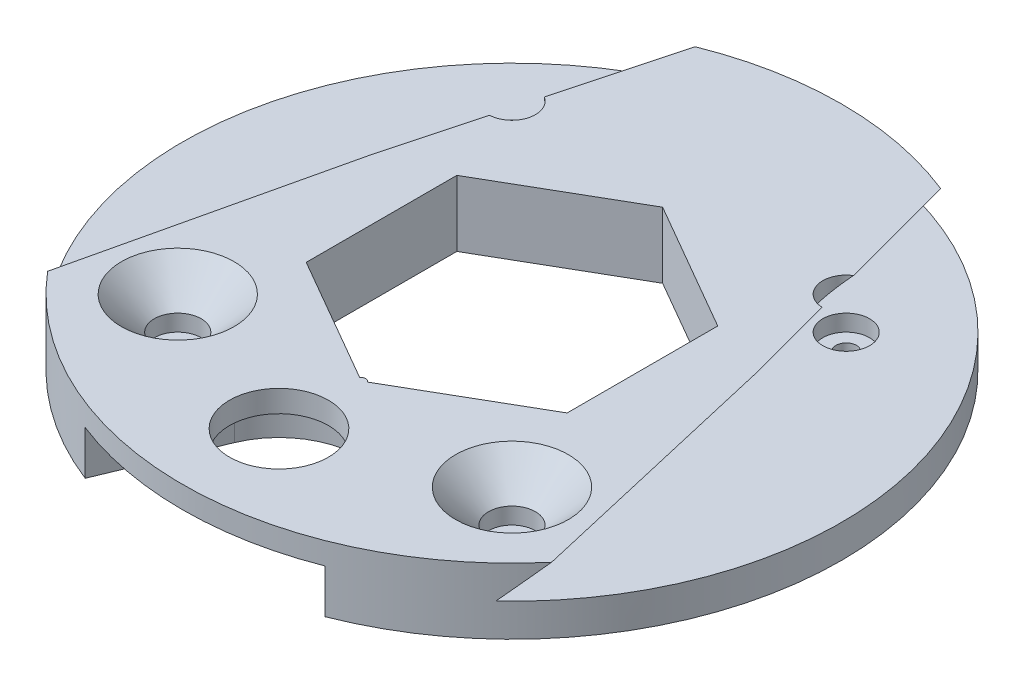
ISO-10303-21;
HEADER;
FILE_DESCRIPTION(('STEP AP214'),'2;1');
FILE_NAME('part.step','',(''),(''),'','','');
FILE_SCHEMA(('AUTOMOTIVE_DESIGN { 1 0 10303 214 1 1 1 1 }'));
ENDSEC;
DATA;
#1=APPLICATION_CONTEXT('core data for automotive mechanical design processes');
#2=APPLICATION_PROTOCOL_DEFINITION('international standard','automotive_design',2000,#1);
#3=PRODUCT_CONTEXT('',#1,'mechanical');
#4=PRODUCT('Part','Part','',(#3));
#5=PRODUCT_RELATED_PRODUCT_CATEGORY('part','',(#4));
#6=PRODUCT_DEFINITION_FORMATION('','',#4);
#7=PRODUCT_DEFINITION_CONTEXT('part definition',#1,'design');
#8=PRODUCT_DEFINITION('design','',#6,#7);
#9=PRODUCT_DEFINITION_SHAPE('','',#8);
#10=(LENGTH_UNIT() NAMED_UNIT(*) SI_UNIT(.MILLI.,.METRE.));
#11=(NAMED_UNIT(*) PLANE_ANGLE_UNIT() SI_UNIT($,.RADIAN.));
#12=(NAMED_UNIT(*) SI_UNIT($,.STERADIAN.) SOLID_ANGLE_UNIT());
#13=UNCERTAINTY_MEASURE_WITH_UNIT(LENGTH_MEASURE(1.E-05),#10,'distance_accuracy_value','');
#14=(GEOMETRIC_REPRESENTATION_CONTEXT(3) GLOBAL_UNCERTAINTY_ASSIGNED_CONTEXT((#13)) GLOBAL_UNIT_ASSIGNED_CONTEXT((#10,
#11,#12)) REPRESENTATION_CONTEXT('',''));
#15=CARTESIAN_POINT('',(0.,0.,0.));
#16=DIRECTION('',(0.,0.,1.));
#17=DIRECTION('',(1.,0.,0.));
#18=AXIS2_PLACEMENT_3D('',#15,#16,#17);
#19=CARTESIAN_POINT('',(0.,-5.,0.));
#20=DIRECTION('',(0.,1.,0.));
#21=DIRECTION('',(0.,0.,1.));
#22=AXIS2_PLACEMENT_3D('',#19,#20,#21);
#23=PLANE('',#22);
#24=CARTESIAN_POINT('',(-25.3553390593274,-5.,25.3553390593274));
#25=DIRECTION('',(0.,-1.,0.));
#26=DIRECTION('',(0.,0.,-1.));
#27=AXIS2_PLACEMENT_3D('',#24,#25,#26);
#28=CIRCLE('',#27,1.55);
#29=CARTESIAN_POINT('',(-25.3553390593274,-5.,23.8053390593274));
#30=VERTEX_POINT('',#29);
#31=EDGE_CURVE('E243',#30,#30,#28,.T.);
#32=ORIENTED_EDGE('',*,*,#31,.F.);
#33=EDGE_LOOP('',(#32));
#34=FACE_BOUND('',#33,.T.);
#35=CARTESIAN_POINT('',(25.3553390593274,-5.,25.3553390593274));
#36=DIRECTION('',(0.,-1.,0.));
#37=DIRECTION('',(0.,0.,-1.));
#38=AXIS2_PLACEMENT_3D('',#35,#36,#37);
#39=CIRCLE('',#38,1.55);
#40=CARTESIAN_POINT('',(25.3553390593274,-5.,23.8053390593274));
#41=VERTEX_POINT('',#40);
#42=EDGE_CURVE('E256',#41,#41,#39,.F.);
#43=ORIENTED_EDGE('',*,*,#42,.T.);
#44=EDGE_LOOP('',(#43));
#45=FACE_BOUND('',#44,.T.);
#46=CARTESIAN_POINT('',(-25.3553390593274,-5.,-25.3553390593274));
#47=DIRECTION('',(0.,-1.,0.));
#48=DIRECTION('',(0.,0.,-1.));
#49=AXIS2_PLACEMENT_3D('',#46,#47,#48);
#50=CIRCLE('',#49,1.55);
#51=CARTESIAN_POINT('',(-25.3553390593274,-5.,-26.9053390593274));
#52=VERTEX_POINT('',#51);
#53=EDGE_CURVE('E265',#52,#52,#50,.F.);
#54=ORIENTED_EDGE('',*,*,#53,.T.);
#55=EDGE_LOOP('',(#54));
#56=FACE_BOUND('',#55,.T.);
#57=CARTESIAN_POINT('',(25.3553390593274,-5.,-25.3553390593274));
#58=DIRECTION('',(0.,-1.,0.));
#59=DIRECTION('',(0.,0.,-1.));
#60=AXIS2_PLACEMENT_3D('',#57,#58,#59);
#61=CIRCLE('',#60,1.55);
#62=CARTESIAN_POINT('',(25.3553390593274,-5.,-26.9053390593274));
#63=VERTEX_POINT('',#62);
#64=EDGE_CURVE('E274',#63,#63,#61,.T.);
#65=ORIENTED_EDGE('',*,*,#64,.F.);
#66=EDGE_LOOP('',(#65));
#67=FACE_BOUND('',#66,.T.);
#68=CARTESIAN_POINT('',(0.,-5.,0.));
#69=DIRECTION('',(0.,1.,0.));
#70=DIRECTION('',(0.,0.,1.));
#71=AXIS2_PLACEMENT_3D('',#68,#69,#70);
#72=CIRCLE('',#71,50.);
#73=CARTESIAN_POINT('',(18.1786062240242,-5.,46.5783026284972));
#74=VERTEX_POINT('',#73);
#75=CARTESIAN_POINT('',(-18.1786062240242,-5.,46.5783026284972));
#76=VERTEX_POINT('',#75);
#77=EDGE_CURVE('E341',#74,#76,#72,.T.);
#78=ORIENTED_EDGE('',*,*,#77,.F.);
#79=DIRECTION('',(0.382683432365087,0.,0.923879532511288));
#80=VECTOR('',#79,1.);
#81=CARTESIAN_POINT('',(-0.951505843608835,-5.,0.394126625100029));
#82=LINE('',#81,#80);
#83=CARTESIAN_POINT('',(11.5484941563911,-5.,30.5717961547638));
#84=VERTEX_POINT('',#83);
#85=EDGE_CURVE('E304',#84,#74,#82,.T.);
#86=ORIENTED_EDGE('',*,*,#85,.F.);
#87=CARTESIAN_POINT('',(0.,-5.,35.3553390593274));
#88=DIRECTION('',(0.,-1.,0.));
#89=DIRECTION('',(0.,0.,-1.));
#90=AXIS2_PLACEMENT_3D('',#87,#88,#89);
#91=CIRCLE('',#90,12.5);
#92=CARTESIAN_POINT('',(-11.5484941563911,-5.,30.5717961547638));
#93=VERTEX_POINT('',#92);
#94=EDGE_CURVE('E319',#93,#84,#91,.T.);
#95=ORIENTED_EDGE('',*,*,#94,.F.);
#96=DIRECTION('',(0.382683432365088,0.,-0.923879532511288));
#97=VECTOR('',#96,1.);
#98=CARTESIAN_POINT('',(0.951505843608841,-5.,0.394126625100032));
#99=LINE('',#98,#97);
#100=EDGE_CURVE('E299',#76,#93,#99,.T.);
#101=ORIENTED_EDGE('',*,*,#100,.F.);
#102=EDGE_LOOP('',(#78,#86,#95,#101));
#103=FACE_BOUND('',#102,.T.);
#104=CARTESIAN_POINT('',(0.,-5.,22.8553390593274));
#105=DIRECTION('',(0.,1.,0.));
#106=DIRECTION('',(0.,0.,1.));
#107=AXIS2_PLACEMENT_3D('',#104,#105,#106);
#108=CIRCLE('',#107,0.663866640803791);
#109=CARTESIAN_POINT('',(0.574925375661118,-5.,22.5234057389255));
#110=VERTEX_POINT('',#109);
#111=CARTESIAN_POINT('',(-0.574925375661127,-5.,22.5234057389255));
#112=VERTEX_POINT('',#111);
#113=EDGE_CURVE('E195',#110,#112,#108,.T.);
#114=ORIENTED_EDGE('',*,*,#113,.F.);
#115=DIRECTION('',(0.866025403784438,0.,-0.500000000000001));
#116=VECTOR('',#115,1.);
#117=CARTESIAN_POINT('',(9.89665211874214,-5.,17.1415042944955));
#118=LINE('',#117,#116);
#119=CARTESIAN_POINT('',(19.7933042374843,-5.,11.4276695296636));
#120=VERTEX_POINT('',#119);
#121=EDGE_CURVE('E204',#110,#120,#118,.T.);
#122=ORIENTED_EDGE('',*,*,#121,.T.);
#123=DIRECTION('',(0.,0.,-1.));
#124=VECTOR('',#123,1.);
#125=CARTESIAN_POINT('',(19.7933042374842,-5.,0.));
#126=LINE('',#125,#124);
#127=CARTESIAN_POINT('',(19.7933042374842,-5.,-11.4276695296638));
#128=VERTEX_POINT('',#127);
#129=EDGE_CURVE('E78',#120,#128,#126,.T.);
#130=ORIENTED_EDGE('',*,*,#129,.T.);
#131=DIRECTION('',(-0.866025403784442,0.,-0.499999999999995));
#132=VECTOR('',#131,1.);
#133=CARTESIAN_POINT('',(9.89665211874202,-5.,-17.1415042944956));
#134=LINE('',#133,#132);
#135=CARTESIAN_POINT('',(-1.56125112837913E-13,-5.,-22.8553390593274));
#136=VERTEX_POINT('',#135);
#137=EDGE_CURVE('E218',#128,#136,#134,.T.);
#138=ORIENTED_EDGE('',*,*,#137,.T.);
#139=DIRECTION('',(-0.866025403784435,0.,0.500000000000007));
#140=VECTOR('',#139,1.);
#141=CARTESIAN_POINT('',(-9.89665211874225,-5.,-17.1415042944954));
#142=LINE('',#141,#140);
#143=CARTESIAN_POINT('',(-19.7933042374844,-5.,-11.4276695296635));
#144=VERTEX_POINT('',#143);
#145=EDGE_CURVE('E221',#136,#144,#142,.T.);
#146=ORIENTED_EDGE('',*,*,#145,.T.);
#147=DIRECTION('',(0.,0.,1.));
#148=VECTOR('',#147,1.);
#149=CARTESIAN_POINT('',(-19.7933042374842,-5.,2.04314785428253E-13));
#150=LINE('',#149,#148);
#151=CARTESIAN_POINT('',(-19.7933042374841,-5.,11.4276695296639));
#152=VERTEX_POINT('',#151);
#153=EDGE_CURVE('E224',#144,#152,#150,.T.);
#154=ORIENTED_EDGE('',*,*,#153,.T.);
#155=DIRECTION('',(0.866025403784441,0.,0.499999999999995));
#156=VECTOR('',#155,1.);
#157=CARTESIAN_POINT('',(-9.89665211874206,-5.,17.1415042944956));
#158=LINE('',#157,#156);
#159=EDGE_CURVE('E201',#152,#112,#158,.T.);
#160=ORIENTED_EDGE('',*,*,#159,.T.);
#161=EDGE_LOOP('',(#114,#122,#130,#138,#146,#154,#160));
#162=FACE_BOUND('',#161,.T.);
#163=ADVANCED_FACE('F62',(#34,#45,#56,#67,#103,#162),#23,.F.);
#164=CARTESIAN_POINT('',(0.,5.,0.));
#165=DIRECTION('',(0.,1.,0.));
#166=DIRECTION('',(0.,0.,1.));
#167=AXIS2_PLACEMENT_3D('',#164,#165,#166);
#168=PLANE('',#167);
#169=CARTESIAN_POINT('',(25.3553390593274,5.,25.3553390593274));
#170=DIRECTION('',(0.,1.,0.));
#171=DIRECTION('',(0.,0.,1.));
#172=AXIS2_PLACEMENT_3D('',#169,#170,#171);
#173=CIRCLE('',#172,8.55000000000002);
#174=CARTESIAN_POINT('',(25.3553390593274,5.,33.9053390593274));
#175=VERTEX_POINT('',#174);
#176=EDGE_CURVE('E71',#175,#175,#173,.F.);
#177=ORIENTED_EDGE('',*,*,#176,.T.);
#178=EDGE_LOOP('',(#177));
#179=FACE_BOUND('',#178,.T.);
#180=CARTESIAN_POINT('',(-25.3553390593274,5.,25.3553390593274));
#181=DIRECTION('',(0.,1.,0.));
#182=DIRECTION('',(0.,0.,1.));
#183=AXIS2_PLACEMENT_3D('',#180,#181,#182);
#184=CIRCLE('',#183,8.55);
#185=CARTESIAN_POINT('',(-25.3553390593274,5.,33.9053390593274));
#186=VERTEX_POINT('',#185);
#187=EDGE_CURVE('E391',#186,#186,#184,.F.);
#188=ORIENTED_EDGE('',*,*,#187,.T.);
#189=EDGE_LOOP('',(#188));
#190=FACE_BOUND('',#189,.T.);
#191=CARTESIAN_POINT('',(0.,5.,35.3553390593274));
#192=DIRECTION('',(0.,-1.,0.));
#193=DIRECTION('',(0.,0.,-1.));
#194=AXIS2_PLACEMENT_3D('',#191,#192,#193);
#195=CIRCLE('',#194,7.5);
#196=CARTESIAN_POINT('',(0.,5.,27.8553390593274));
#197=VERTEX_POINT('',#196);
#198=EDGE_CURVE('E326',#197,#197,#195,.T.);
#199=ORIENTED_EDGE('',*,*,#198,.T.);
#200=EDGE_LOOP('',(#199));
#201=FACE_BOUND('',#200,.T.);
#202=DIRECTION('',(0.258819045102514,0.,-0.96592582628907));
#203=VECTOR('',#202,1.);
#204=CARTESIAN_POINT('',(-28.9777747894681,5.,-7.76457135328871));
#205=LINE('',#204,#203);
#206=CARTESIAN_POINT('',(-23.4600344508429,5.,-28.3570586400107));
#207=VERTEX_POINT('',#206);
#208=CARTESIAN_POINT('',(-18.6250129855275,5.,-46.4016044042545));
#209=VERTEX_POINT('',#208);
#210=EDGE_CURVE('E338',#207,#209,#205,.T.);
#211=ORIENTED_EDGE('',*,*,#210,.F.);
#212=CARTESIAN_POINT('',(-25.3553390593274,5.,-25.3553390593274));
#213=DIRECTION('',(0.,-1.,0.));
#214=DIRECTION('',(0.,0.,-1.));
#215=AXIS2_PLACEMENT_3D('',#212,#213,#214);
#216=CIRCLE('',#215,3.55);
#217=CARTESIAN_POINT('',(-25.2148169108117,5.,-21.8081213431762));
#218=VERTEX_POINT('',#217);
#219=EDGE_CURVE('E280',#218,#207,#216,.F.);
#220=ORIENTED_EDGE('',*,*,#219,.F.);
#221=CARTESIAN_POINT('',(-29.0000460770927,5.,-7.68145377632381));
#222=VERTEX_POINT('',#221);
#223=EDGE_CURVE('E362',#222,#218,#205,.T.);
#224=ORIENTED_EDGE('',*,*,#223,.F.);
#225=DIRECTION('',(0.225428589041607,0.,-0.974259693943412));
#226=VECTOR('',#225,1.);
#227=CARTESIAN_POINT('',(-29.2133671977581,5.,-6.75952026906645));
#228=LINE('',#227,#226);
#229=CARTESIAN_POINT('',(-38.2330128463024,5.,32.2216810345841));
#230=VERTEX_POINT('',#229);
#231=EDGE_CURVE('E365',#230,#222,#228,.T.);
#232=ORIENTED_EDGE('',*,*,#231,.F.);
#233=CARTESIAN_POINT('',(0.,5.,0.));
#234=DIRECTION('',(0.,1.,0.));
#235=DIRECTION('',(0.,0.,1.));
#236=AXIS2_PLACEMENT_3D('',#233,#234,#235);
#237=CIRCLE('',#236,50.);
#238=CARTESIAN_POINT('',(38.2330128463024,5.,32.2216810345841));
#239=VERTEX_POINT('',#238);
#240=EDGE_CURVE('E340',#230,#239,#237,.T.);
#241=ORIENTED_EDGE('',*,*,#240,.T.);
#242=DIRECTION('',(0.225428589041607,0.,0.974259693943412));
#243=VECTOR('',#242,1.);
#244=CARTESIAN_POINT('',(29.2133671977581,5.,-6.75952026906647));
#245=LINE('',#244,#243);
#246=CARTESIAN_POINT('',(29.0000460770927,5.,-7.68145377632363));
#247=VERTEX_POINT('',#246);
#248=EDGE_CURVE('E373',#239,#247,#245,.F.);
#249=ORIENTED_EDGE('',*,*,#248,.T.);
#250=DIRECTION('',(0.258819045102514,0.,0.96592582628907));
#251=VECTOR('',#250,1.);
#252=CARTESIAN_POINT('',(28.9777747894681,5.,-7.76457135328871));
#253=LINE('',#252,#251);
#254=CARTESIAN_POINT('',(25.2148169108117,5.,-21.8081213431762));
#255=VERTEX_POINT('',#254);
#256=EDGE_CURVE('E339',#247,#255,#253,.F.);
#257=ORIENTED_EDGE('',*,*,#256,.T.);
#258=CARTESIAN_POINT('',(25.3553390593274,5.,-25.3553390593274));
#259=DIRECTION('',(0.,-1.,0.));
#260=DIRECTION('',(0.,0.,-1.));
#261=AXIS2_PLACEMENT_3D('',#258,#259,#260);
#262=CIRCLE('',#261,3.55);
#263=CARTESIAN_POINT('',(23.4600344508429,5.,-28.3570586400107));
#264=VERTEX_POINT('',#263);
#265=EDGE_CURVE('E283',#255,#264,#262,.T.);
#266=ORIENTED_EDGE('',*,*,#265,.T.);
#267=CARTESIAN_POINT('',(18.6250129855275,5.,-46.4016044042545));
#268=VERTEX_POINT('',#267);
#269=EDGE_CURVE('E377',#264,#268,#253,.F.);
#270=ORIENTED_EDGE('',*,*,#269,.T.);
#271=EDGE_CURVE('E335',#268,#209,#237,.T.);
#272=ORIENTED_EDGE('',*,*,#271,.T.);
#273=EDGE_LOOP('',(#211,#220,#224,#232,#241,#249,#257,#266,#270,#272));
#274=FACE_BOUND('',#273,.T.);
#275=DIRECTION('',(0.866025403784438,0.,-0.500000000000001));
#276=VECTOR('',#275,1.);
#277=CARTESIAN_POINT('',(9.89665211874214,5.,17.1415042944955));
#278=LINE('',#277,#276);
#279=CARTESIAN_POINT('',(0.574925375661117,5.,22.5234057389255));
#280=VERTEX_POINT('',#279);
#281=CARTESIAN_POINT('',(19.7933042374843,5.,11.4276695296636));
#282=VERTEX_POINT('',#281);
#283=EDGE_CURVE('E228',#280,#282,#278,.T.);
#284=ORIENTED_EDGE('',*,*,#283,.F.);
#285=CARTESIAN_POINT('',(0.,5.,22.8553390593274));
#286=DIRECTION('',(0.,1.,0.));
#287=DIRECTION('',(0.,0.,1.));
#288=AXIS2_PLACEMENT_3D('',#285,#286,#287);
#289=CIRCLE('',#288,0.663866640803791);
#290=CARTESIAN_POINT('',(-0.574925375661127,5.,22.5234057389255));
#291=VERTEX_POINT('',#290);
#292=EDGE_CURVE('E86',#280,#291,#289,.T.);
#293=ORIENTED_EDGE('',*,*,#292,.T.);
#294=DIRECTION('',(0.866025403784441,0.,0.499999999999995));
#295=VECTOR('',#294,1.);
#296=CARTESIAN_POINT('',(-9.89665211874206,5.,17.1415042944956));
#297=LINE('',#296,#295);
#298=CARTESIAN_POINT('',(-19.7933042374841,5.,11.4276695296639));
#299=VERTEX_POINT('',#298);
#300=EDGE_CURVE('E211',#299,#291,#297,.T.);
#301=ORIENTED_EDGE('',*,*,#300,.F.);
#302=DIRECTION('',(0.,0.,1.));
#303=VECTOR('',#302,1.);
#304=CARTESIAN_POINT('',(-19.7933042374842,5.,2.04314785428253E-13));
#305=LINE('',#304,#303);
#306=CARTESIAN_POINT('',(-19.7933042374844,5.,-11.4276695296635));
#307=VERTEX_POINT('',#306);
#308=EDGE_CURVE('E214',#307,#299,#305,.T.);
#309=ORIENTED_EDGE('',*,*,#308,.F.);
#310=DIRECTION('',(-0.866025403784435,0.,0.500000000000007));
#311=VECTOR('',#310,1.);
#312=CARTESIAN_POINT('',(-9.89665211874225,5.,-17.1415042944954));
#313=LINE('',#312,#311);
#314=CARTESIAN_POINT('',(-1.56125112837913E-13,5.,-22.8553390593274));
#315=VERTEX_POINT('',#314);
#316=EDGE_CURVE('E236',#315,#307,#313,.T.);
#317=ORIENTED_EDGE('',*,*,#316,.F.);
#318=DIRECTION('',(-0.866025403784442,0.,-0.499999999999995));
#319=VECTOR('',#318,1.);
#320=CARTESIAN_POINT('',(9.89665211874202,5.,-17.1415042944956));
#321=LINE('',#320,#319);
#322=CARTESIAN_POINT('',(19.7933042374842,5.,-11.4276695296638));
#323=VERTEX_POINT('',#322);
#324=EDGE_CURVE('E233',#323,#315,#321,.T.);
#325=ORIENTED_EDGE('',*,*,#324,.F.);
#326=DIRECTION('',(0.,0.,-1.));
#327=VECTOR('',#326,1.);
#328=CARTESIAN_POINT('',(19.7933042374842,5.,0.));
#329=LINE('',#328,#327);
#330=EDGE_CURVE('E230',#282,#323,#329,.T.);
#331=ORIENTED_EDGE('',*,*,#330,.F.);
#332=EDGE_LOOP('',(#284,#293,#301,#309,#317,#325,#331));
#333=FACE_BOUND('',#332,.T.);
#334=ADVANCED_FACE('F396',(#179,#190,#201,#274,#333),#168,.T.);
#335=CARTESIAN_POINT('',(-25.3553390593274,5.,25.3553390593274));
#336=DIRECTION('',(0.,-1.,0.));
#337=DIRECTION('',(0.,0.,-1.));
#338=AXIS2_PLACEMENT_3D('',#335,#336,#337);
#339=CYLINDRICAL_SURFACE('',#338,3.55);
#340=CARTESIAN_POINT('',(-25.3553390593274,0.,25.3553390593274));
#341=DIRECTION('',(0.,1.,0.));
#342=DIRECTION('',(0.,0.,1.));
#343=AXIS2_PLACEMENT_3D('',#340,#341,#342);
#344=CIRCLE('',#343,3.55);
#345=CARTESIAN_POINT('',(-25.3553390593274,0.,28.9053390593274));
#346=VERTEX_POINT('',#345);
#347=EDGE_CURVE('E12',#346,#346,#344,.T.);
#348=ORIENTED_EDGE('',*,*,#347,.T.);
#349=EDGE_LOOP('',(#348));
#350=FACE_BOUND('',#349,.T.);
#351=CARTESIAN_POINT('',(-25.3553390593274,-2.5,25.3553390593274));
#352=DIRECTION('',(0.,-1.,0.));
#353=DIRECTION('',(0.,0.,-1.));
#354=AXIS2_PLACEMENT_3D('',#351,#352,#353);
#355=CIRCLE('',#354,3.55);
#356=CARTESIAN_POINT('',(-25.3553390593274,-2.5,21.8053390593274));
#357=VERTEX_POINT('',#356);
#358=EDGE_CURVE('E385',#357,#357,#355,.F.);
#359=ORIENTED_EDGE('',*,*,#358,.F.);
#360=EDGE_LOOP('',(#359));
#361=FACE_BOUND('',#360,.T.);
#362=ADVANCED_FACE('F408',(#350,#361),#339,.F.);
#363=CARTESIAN_POINT('',(25.3553390593274,5.,25.3553390593274));
#364=DIRECTION('',(0.,-1.,0.));
#365=DIRECTION('',(0.,0.,-1.));
#366=AXIS2_PLACEMENT_3D('',#363,#364,#365);
#367=CYLINDRICAL_SURFACE('',#366,3.55);
#368=CARTESIAN_POINT('',(25.3553390593274,0.,25.3553390593274));
#369=DIRECTION('',(0.,1.,0.));
#370=DIRECTION('',(0.,0.,1.));
#371=AXIS2_PLACEMENT_3D('',#368,#369,#370);
#372=CIRCLE('',#371,3.55);
#373=CARTESIAN_POINT('',(25.3553390593274,0.,28.9053390593274));
#374=VERTEX_POINT('',#373);
#375=EDGE_CURVE('E388',#374,#374,#372,.T.);
#376=ORIENTED_EDGE('',*,*,#375,.T.);
#377=EDGE_LOOP('',(#376));
#378=FACE_BOUND('',#377,.T.);
#379=CARTESIAN_POINT('',(25.3553390593274,-2.5,25.3553390593274));
#380=DIRECTION('',(0.,-1.,0.));
#381=DIRECTION('',(0.,0.,-1.));
#382=AXIS2_PLACEMENT_3D('',#379,#380,#381);
#383=CIRCLE('',#382,3.55);
#384=CARTESIAN_POINT('',(25.3553390593274,-2.5,21.8053390593274));
#385=VERTEX_POINT('',#384);
#386=EDGE_CURVE('E259',#385,#385,#383,.F.);
#387=ORIENTED_EDGE('',*,*,#386,.F.);
#388=EDGE_LOOP('',(#387));
#389=FACE_BOUND('',#388,.T.);
#390=ADVANCED_FACE('F404',(#378,#389),#367,.F.);
#391=CARTESIAN_POINT('',(-25.3553390593274,5.,-25.3553390593274));
#392=DIRECTION('',(0.,-1.,0.));
#393=DIRECTION('',(0.,0.,-1.));
#394=AXIS2_PLACEMENT_3D('',#391,#392,#393);
#395=CYLINDRICAL_SURFACE('',#394,3.55);
#396=CARTESIAN_POINT('',(-25.3553390593274,0.,-25.3553390593274));
#397=DIRECTION('',(0.,1.,0.));
#398=DIRECTION('',(0.,0.,1.));
#399=AXIS2_PLACEMENT_3D('',#396,#397,#398);
#400=CIRCLE('',#399,3.55);
#401=CARTESIAN_POINT('',(-25.3553390593274,0.,-21.8053390593274));
#402=VERTEX_POINT('',#401);
#403=EDGE_CURVE('E296',#402,#402,#400,.F.);
#404=ORIENTED_EDGE('',*,*,#403,.F.);
#405=EDGE_LOOP('',(#404));
#406=FACE_BOUND('',#405,.T.);
#407=CARTESIAN_POINT('',(-25.3553390593274,-2.5,-25.3553390593274));
#408=DIRECTION('',(0.,-1.,0.));
#409=DIRECTION('',(0.,0.,-1.));
#410=AXIS2_PLACEMENT_3D('',#407,#408,#409);
#411=CIRCLE('',#410,3.55);
#412=CARTESIAN_POINT('',(-25.3553390593274,-2.5,-28.9053390593274));
#413=VERTEX_POINT('',#412);
#414=EDGE_CURVE('E268',#413,#413,#411,.F.);
#415=ORIENTED_EDGE('',*,*,#414,.F.);
#416=EDGE_LOOP('',(#415));
#417=FACE_BOUND('',#416,.T.);
#418=ADVANCED_FACE('F407',(#406,#417),#395,.F.);
#419=CARTESIAN_POINT('',(25.3553390593274,5.,-25.3553390593274));
#420=DIRECTION('',(0.,-1.,0.));
#421=DIRECTION('',(0.,0.,-1.));
#422=AXIS2_PLACEMENT_3D('',#419,#420,#421);
#423=CYLINDRICAL_SURFACE('',#422,3.55);
#424=CARTESIAN_POINT('',(25.3553390593274,0.,-25.3553390593274));
#425=DIRECTION('',(0.,1.,0.));
#426=DIRECTION('',(0.,0.,1.));
#427=AXIS2_PLACEMENT_3D('',#424,#425,#426);
#428=CIRCLE('',#427,3.55);
#429=CARTESIAN_POINT('',(25.3553390593274,0.,-21.8053390593274));
#430=VERTEX_POINT('',#429);
#431=EDGE_CURVE('E290',#430,#430,#428,.T.);
#432=ORIENTED_EDGE('',*,*,#431,.T.);
#433=EDGE_LOOP('',(#432));
#434=FACE_BOUND('',#433,.T.);
#435=CARTESIAN_POINT('',(25.3553390593274,-2.5,-25.3553390593274));
#436=DIRECTION('',(0.,-1.,0.));
#437=DIRECTION('',(0.,0.,-1.));
#438=AXIS2_PLACEMENT_3D('',#435,#436,#437);
#439=CIRCLE('',#438,3.55);
#440=CARTESIAN_POINT('',(25.3553390593274,-2.5,-28.9053390593274));
#441=VERTEX_POINT('',#440);
#442=EDGE_CURVE('E344',#441,#441,#439,.F.);
#443=ORIENTED_EDGE('',*,*,#442,.F.);
#444=EDGE_LOOP('',(#443));
#445=FACE_BOUND('',#444,.T.);
#446=ADVANCED_FACE('F487',(#434,#445),#423,.F.);
#447=CARTESIAN_POINT('',(-24.1481456580227,0.,-6.47047612777613));
#448=DIRECTION('',(-0.683012701892219,-0.707106781186549,-0.183012701892214));
#449=DIRECTION('',(0.719254596676404,-0.694746590606865,0.));
#450=AXIS2_PLACEMENT_3D('',#447,#448,#449);
#451=PLANE('',#450);
#452=ORIENTED_EDGE('',*,*,#223,.T.);
#453=CARTESIAN_POINT('',(-25.3553390593274,6.05382147448186,-25.3553390593274));
#454=DIRECTION('',(-0.683012701892219,-0.707106781186549,-0.183012701892214));
#455=DIRECTION('',(0.683012701892222,-0.707106781186546,0.183012701892215));
#456=AXIS2_PLACEMENT_3D('',#453,#454,#455);
#457=ELLIPSE('',#456,5.02045814642448,3.55);
#458=EDGE_CURVE('E293',#218,#207,#457,.F.);
#459=ORIENTED_EDGE('',*,*,#458,.T.);
#460=ORIENTED_EDGE('',*,*,#210,.T.);
#461=CARTESIAN_POINT('',(0.,-25.000000000824,0.));
#462=DIRECTION('',(-0.683012701892219,-0.707106781186549,-0.183012701892214));
#463=DIRECTION('',(-0.683012701892222,0.707106781186546,-0.183012701892215));
#464=AXIS2_PLACEMENT_3D('',#461,#462,#463);
#465=ELLIPSE('',#464,70.7106781186546,50.);
#466=CARTESIAN_POINT('',(-12.9409522560455,0.,-48.2962913142071));
#467=VERTEX_POINT('',#466);
#468=EDGE_CURVE('E351',#209,#467,#465,.T.);
#469=ORIENTED_EDGE('',*,*,#468,.T.);
#470=DIRECTION('',(0.258819045102514,0.,-0.96592582628907));
#471=VECTOR('',#470,1.);
#472=CARTESIAN_POINT('',(-24.1481456580227,0.,-6.47047612777613));
#473=LINE('',#472,#471);
#474=CARTESIAN_POINT('',(-24.1481456580227,0.,-6.47047612777609));
#475=VERTEX_POINT('',#474);
#476=EDGE_CURVE('E357',#475,#467,#473,.T.);
#477=ORIENTED_EDGE('',*,*,#476,.F.);
#478=DIRECTION('',(0.686111536058134,-0.707054428983578,0.171245421961158));
#479=VECTOR('',#478,1.);
#480=CARTESIAN_POINT('',(-24.1409636291716,-0.00740125335516045,-6.46868357729922));
#481=LINE('',#480,#479);
#482=EDGE_CURVE('E349',#222,#475,#481,.T.);
#483=ORIENTED_EDGE('',*,*,#482,.F.);
#484=EDGE_LOOP('',(#452,#459,#460,#469,#477,#483));
#485=FACE_BOUND('',#484,.T.);
#486=ADVANCED_FACE('F469',(#485),#451,.T.);
#487=CARTESIAN_POINT('',(0.,5.,35.3553390593274));
#488=DIRECTION('',(0.,-1.,0.));
#489=DIRECTION('',(0.,0.,-1.));
#490=AXIS2_PLACEMENT_3D('',#487,#488,#489);
#491=CYLINDRICAL_SURFACE('',#490,7.5);
#492=ORIENTED_EDGE('',*,*,#198,.F.);
#493=EDGE_LOOP('',(#492));
#494=FACE_BOUND('',#493,.T.);
#495=CARTESIAN_POINT('',(0.,1.66666666666667,35.3553390593274));
#496=DIRECTION('',(0.,-1.,0.));
#497=DIRECTION('',(0.,0.,-1.));
#498=AXIS2_PLACEMENT_3D('',#495,#496,#497);
#499=CIRCLE('',#498,7.5);
#500=CARTESIAN_POINT('',(0.,1.66666666666667,27.8553390593274));
#501=VERTEX_POINT('',#500);
#502=EDGE_CURVE('E313',#501,#501,#499,.F.);
#503=ORIENTED_EDGE('',*,*,#502,.F.);
#504=EDGE_LOOP('',(#503));
#505=FACE_BOUND('',#504,.T.);
#506=ADVANCED_FACE('F465',(#494,#505),#491,.F.);
#507=CARTESIAN_POINT('',(0.,0.,0.));
#508=DIRECTION('',(0.,1.,0.));
#509=DIRECTION('',(0.,0.,1.));
#510=AXIS2_PLACEMENT_3D('',#507,#508,#509);
#511=PLANE('',#510);
#512=ORIENTED_EDGE('',*,*,#403,.T.);
#513=EDGE_LOOP('',(#512));
#514=FACE_BOUND('',#513,.T.);
#515=CARTESIAN_POINT('',(0.,0.,0.));
#516=DIRECTION('',(0.,1.,0.));
#517=DIRECTION('',(0.,0.,1.));
#518=AXIS2_PLACEMENT_3D('',#515,#516,#517);
#519=CIRCLE('',#518,50.);
#520=CARTESIAN_POINT('',(-34.10533906,0.,36.562629112284));
#521=VERTEX_POINT('',#520);
#522=EDGE_CURVE('E348',#467,#521,#519,.T.);
#523=ORIENTED_EDGE('',*,*,#522,.T.);
#524=DIRECTION('',(0.225428589041607,0.,-0.974259693943412));
#525=VECTOR('',#524,1.);
#526=CARTESIAN_POINT('',(-24.3420687280411,0.,-5.63237732385841));
#527=LINE('',#526,#525);
#528=EDGE_CURVE('E353',#521,#475,#527,.T.);
#529=ORIENTED_EDGE('',*,*,#528,.T.);
#530=ORIENTED_EDGE('',*,*,#476,.T.);
#531=EDGE_LOOP('',(#523,#529,#530));
#532=FACE_BOUND('',#531,.T.);
#533=ADVANCED_FACE('F468',(#514,#532),#511,.T.);
#534=CARTESIAN_POINT('',(0.,-5.,0.));
#535=DIRECTION('',(0.,1.,0.));
#536=DIRECTION('',(0.,0.,1.));
#537=AXIS2_PLACEMENT_3D('',#534,#535,#536);
#538=CYLINDRICAL_SURFACE('',#537,50.);
#539=DIRECTION('',(0.,-1.,0.));
#540=VECTOR('',#539,1.);
#541=CARTESIAN_POINT('',(18.1786062240242,1.66666666666667,46.5783026284972));
#542=LINE('',#541,#540);
#543=CARTESIAN_POINT('',(18.1786062240242,1.66666666666667,46.5783026284972));
#544=VERTEX_POINT('',#543);
#545=EDGE_CURVE('E323',#544,#74,#542,.T.);
#546=ORIENTED_EDGE('',*,*,#545,.T.);
#547=ORIENTED_EDGE('',*,*,#77,.T.);
#548=DIRECTION('',(0.,-1.,0.));
#549=VECTOR('',#548,1.);
#550=CARTESIAN_POINT('',(-18.1786062240242,1.66666666666667,46.5783026284972));
#551=LINE('',#550,#549);
#552=CARTESIAN_POINT('',(-18.1786062240242,1.66666666666667,46.5783026284972));
#553=VERTEX_POINT('',#552);
#554=EDGE_CURVE('E316',#553,#76,#551,.T.);
#555=ORIENTED_EDGE('',*,*,#554,.F.);
#556=CARTESIAN_POINT('',(0.,1.66666666666667,0.));
#557=DIRECTION('',(0.,-1.,0.));
#558=DIRECTION('',(0.,0.,-1.));
#559=AXIS2_PLACEMENT_3D('',#556,#557,#558);
#560=CIRCLE('',#559,50.);
#561=EDGE_CURVE('E300',#544,#553,#560,.T.);
#562=ORIENTED_EDGE('',*,*,#561,.F.);
#563=EDGE_LOOP('',(#546,#547,#555,#562));
#564=FACE_BOUND('',#563,.T.);
#565=CARTESIAN_POINT('',(34.10533906,0.,36.562629112284));
#566=VERTEX_POINT('',#565);
#567=CARTESIAN_POINT('',(12.9409522560455,0.,-48.2962913142071));
#568=VERTEX_POINT('',#567);
#569=EDGE_CURVE('E345',#566,#568,#519,.T.);
#570=ORIENTED_EDGE('',*,*,#569,.F.);
#571=CARTESIAN_POINT('',(0.,-24.985195301998,0.));
#572=DIRECTION('',(0.688905636224115,-0.707106781186549,-0.159402083984636));
#573=DIRECTION('',(0.688905636224118,0.707106781186546,-0.159402083984636));
#574=AXIS2_PLACEMENT_3D('',#571,#572,#573);
#575=ELLIPSE('',#574,70.7106781186546,50.);
#576=EDGE_CURVE('E369',#239,#566,#575,.T.);
#577=ORIENTED_EDGE('',*,*,#576,.F.);
#578=ORIENTED_EDGE('',*,*,#240,.F.);
#579=CARTESIAN_POINT('',(0.,-24.985195301998,0.));
#580=DIRECTION('',(-0.688905636224116,-0.707106781186549,-0.159402083984635));
#581=DIRECTION('',(-0.688905636224118,0.707106781186546,-0.159402083984636));
#582=AXIS2_PLACEMENT_3D('',#579,#580,#581);
#583=ELLIPSE('',#582,70.7106781186546,50.);
#584=EDGE_CURVE('E352',#230,#521,#583,.F.);
#585=ORIENTED_EDGE('',*,*,#584,.T.);
#586=ORIENTED_EDGE('',*,*,#522,.F.);
#587=ORIENTED_EDGE('',*,*,#468,.F.);
#588=ORIENTED_EDGE('',*,*,#271,.F.);
#589=CARTESIAN_POINT('',(0.,-25.000000000824,0.));
#590=DIRECTION('',(0.683012701892219,-0.707106781186549,-0.183012701892214));
#591=DIRECTION('',(0.683012701892222,0.707106781186546,-0.183012701892215));
#592=AXIS2_PLACEMENT_3D('',#589,#590,#591);
#593=ELLIPSE('',#592,70.7106781186546,50.);
#594=EDGE_CURVE('E361',#268,#568,#593,.F.);
#595=ORIENTED_EDGE('',*,*,#594,.T.);
#596=EDGE_LOOP('',(#570,#577,#578,#585,#586,#587,#588,#595));
#597=FACE_BOUND('',#596,.T.);
#598=ADVANCED_FACE('F440',(#564,#597),#538,.T.);
#599=ORIENTED_EDGE('',*,*,#431,.F.);
#600=EDGE_LOOP('',(#599));
#601=FACE_BOUND('',#600,.T.);
#602=DIRECTION('',(0.258819045102514,0.,0.96592582628907));
#603=VECTOR('',#602,1.);
#604=CARTESIAN_POINT('',(24.1481456580227,0.,-6.47047612777613));
#605=LINE('',#604,#603);
#606=CARTESIAN_POINT('',(24.1481456580228,0.,-6.47047612777591));
#607=VERTEX_POINT('',#606);
#608=EDGE_CURVE('E334',#607,#568,#605,.F.);
#609=ORIENTED_EDGE('',*,*,#608,.F.);
#610=DIRECTION('',(0.225428589041607,0.,0.974259693943412));
#611=VECTOR('',#610,1.);
#612=CARTESIAN_POINT('',(24.3420687280411,0.,-5.63237732385843));
#613=LINE('',#612,#611);
#614=EDGE_CURVE('E356',#566,#607,#613,.F.);
#615=ORIENTED_EDGE('',*,*,#614,.F.);
#616=ORIENTED_EDGE('',*,*,#569,.T.);
#617=EDGE_LOOP('',(#609,#615,#616));
#618=FACE_BOUND('',#617,.T.);
#619=ADVANCED_FACE('F473',(#601,#618),#511,.T.);
#620=CARTESIAN_POINT('',(24.1481456580227,0.,-6.47047612777613));
#621=DIRECTION('',(0.683012701892219,-0.707106781186549,-0.183012701892214));
#622=DIRECTION('',(0.719254596676404,0.694746590606865,0.));
#623=AXIS2_PLACEMENT_3D('',#620,#621,#622);
#624=PLANE('',#623);
#625=ORIENTED_EDGE('',*,*,#269,.F.);
#626=CARTESIAN_POINT('',(25.3553390593274,6.05382147448186,-25.3553390593274));
#627=DIRECTION('',(0.683012701892219,-0.707106781186549,-0.183012701892214));
#628=DIRECTION('',(-0.683012701892222,-0.707106781186546,0.183012701892215));
#629=AXIS2_PLACEMENT_3D('',#626,#627,#628);
#630=ELLIPSE('',#629,5.02045814642448,3.55);
#631=EDGE_CURVE('E286',#264,#255,#630,.F.);
#632=ORIENTED_EDGE('',*,*,#631,.T.);
#633=ORIENTED_EDGE('',*,*,#256,.F.);
#634=DIRECTION('',(-0.686111536058134,-0.707054428983578,0.171245421961156));
#635=VECTOR('',#634,1.);
#636=CARTESIAN_POINT('',(24.1481456580228,0.,-6.47047612777591));
#637=LINE('',#636,#635);
#638=EDGE_CURVE('E370',#247,#607,#637,.T.);
#639=ORIENTED_EDGE('',*,*,#638,.T.);
#640=ORIENTED_EDGE('',*,*,#608,.T.);
#641=ORIENTED_EDGE('',*,*,#594,.F.);
#642=EDGE_LOOP('',(#625,#632,#633,#639,#640,#641));
#643=FACE_BOUND('',#642,.T.);
#644=ADVANCED_FACE('F476',(#643),#624,.T.);
#645=CARTESIAN_POINT('',(-24.3420687280411,0.,-5.63237732385841));
#646=DIRECTION('',(-0.688905636224116,-0.707106781186549,-0.159402083984635));
#647=DIRECTION('',(0.71626513077411,-0.697828247090319,0.));
#648=AXIS2_PLACEMENT_3D('',#645,#646,#647);
#649=PLANE('',#648);
#650=ORIENTED_EDGE('',*,*,#528,.F.);
#651=ORIENTED_EDGE('',*,*,#584,.F.);
#652=ORIENTED_EDGE('',*,*,#231,.T.);
#653=ORIENTED_EDGE('',*,*,#482,.T.);
#654=EDGE_LOOP('',(#650,#651,#652,#653));
#655=FACE_BOUND('',#654,.T.);
#656=ADVANCED_FACE('F480',(#655),#649,.T.);
#657=CARTESIAN_POINT('',(24.3420687280411,0.,-5.63237732385843));
#658=DIRECTION('',(0.688905636224115,-0.707106781186549,-0.159402083984636));
#659=DIRECTION('',(0.71626513077411,0.697828247090319,0.));
#660=AXIS2_PLACEMENT_3D('',#657,#658,#659);
#661=PLANE('',#660);
#662=ORIENTED_EDGE('',*,*,#614,.T.);
#663=ORIENTED_EDGE('',*,*,#638,.F.);
#664=ORIENTED_EDGE('',*,*,#248,.F.);
#665=ORIENTED_EDGE('',*,*,#576,.T.);
#666=EDGE_LOOP('',(#662,#663,#664,#665));
#667=FACE_BOUND('',#666,.T.);
#668=ADVANCED_FACE('F483',(#667),#661,.T.);
#669=CARTESIAN_POINT('',(-0.951505843608835,1.66666666666667,0.394126625100029));
#670=DIRECTION('',(0.923879532511288,0.,-0.382683432365087));
#671=DIRECTION('',(-0.382683432365087,0.,-0.923879532511288));
#672=AXIS2_PLACEMENT_3D('',#669,#670,#671);
#673=PLANE('',#672);
#674=ORIENTED_EDGE('',*,*,#85,.T.);
#675=ORIENTED_EDGE('',*,*,#545,.F.);
#676=DIRECTION('',(0.382683432365087,0.,0.923879532511288));
#677=VECTOR('',#676,1.);
#678=CARTESIAN_POINT('',(-0.951505843608835,1.66666666666667,0.394126625100029));
#679=LINE('',#678,#677);
#680=CARTESIAN_POINT('',(11.5484941563911,1.66666666666667,30.5717961547638));
#681=VERTEX_POINT('',#680);
#682=EDGE_CURVE('E310',#681,#544,#679,.T.);
#683=ORIENTED_EDGE('',*,*,#682,.F.);
#684=DIRECTION('',(0.,-1.,0.));
#685=VECTOR('',#684,1.);
#686=CARTESIAN_POINT('',(11.5484941563911,1.66666666666667,30.5717961547638));
#687=LINE('',#686,#685);
#688=EDGE_CURVE('E327',#681,#84,#687,.T.);
#689=ORIENTED_EDGE('',*,*,#688,.T.);
#690=EDGE_LOOP('',(#674,#675,#683,#689));
#691=FACE_BOUND('',#690,.T.);
#692=ADVANCED_FACE('F445',(#691),#673,.F.);
#693=CARTESIAN_POINT('',(0.,1.66666666666667,35.3553390593274));
#694=DIRECTION('',(0.,-1.,0.));
#695=DIRECTION('',(0.,0.,-1.));
#696=AXIS2_PLACEMENT_3D('',#693,#694,#695);
#697=CYLINDRICAL_SURFACE('',#696,12.5);
#698=ORIENTED_EDGE('',*,*,#94,.T.);
#699=ORIENTED_EDGE('',*,*,#688,.F.);
#700=CARTESIAN_POINT('',(0.,1.66666666666667,35.3553390593274));
#701=DIRECTION('',(0.,-1.,0.));
#702=DIRECTION('',(0.,0.,-1.));
#703=AXIS2_PLACEMENT_3D('',#700,#701,#702);
#704=CIRCLE('',#703,12.5);
#705=CARTESIAN_POINT('',(-11.5484941563911,1.66666666666667,30.5717961547638));
#706=VERTEX_POINT('',#705);
#707=EDGE_CURVE('E307',#706,#681,#704,.T.);
#708=ORIENTED_EDGE('',*,*,#707,.F.);
#709=DIRECTION('',(0.,-1.,0.));
#710=VECTOR('',#709,1.);
#711=CARTESIAN_POINT('',(-11.5484941563911,1.66666666666667,30.5717961547638));
#712=LINE('',#711,#710);
#713=EDGE_CURVE('E329',#706,#93,#712,.T.);
#714=ORIENTED_EDGE('',*,*,#713,.T.);
#715=EDGE_LOOP('',(#698,#699,#708,#714));
#716=FACE_BOUND('',#715,.T.);
#717=ADVANCED_FACE('F451',(#716),#697,.F.);
#718=CARTESIAN_POINT('',(0.951505843608841,1.66666666666667,0.394126625100032));
#719=DIRECTION('',(-0.923879532511288,0.,-0.382683432365087));
#720=DIRECTION('',(-0.382683432365088,0.,0.923879532511288));
#721=AXIS2_PLACEMENT_3D('',#718,#719,#720);
#722=PLANE('',#721);
#723=ORIENTED_EDGE('',*,*,#100,.T.);
#724=ORIENTED_EDGE('',*,*,#713,.F.);
#725=DIRECTION('',(0.382683432365088,0.,-0.923879532511288));
#726=VECTOR('',#725,1.);
#727=CARTESIAN_POINT('',(0.951505843608841,1.66666666666667,0.394126625100032));
#728=LINE('',#727,#726);
#729=EDGE_CURVE('E303',#553,#706,#728,.T.);
#730=ORIENTED_EDGE('',*,*,#729,.F.);
#731=ORIENTED_EDGE('',*,*,#554,.T.);
#732=EDGE_LOOP('',(#723,#724,#730,#731));
#733=FACE_BOUND('',#732,.T.);
#734=ADVANCED_FACE('F453',(#733),#722,.F.);
#735=CARTESIAN_POINT('',(0.,1.66666666666667,0.));
#736=DIRECTION('',(0.,-1.,0.));
#737=DIRECTION('',(0.,0.,-1.));
#738=AXIS2_PLACEMENT_3D('',#735,#736,#737);
#739=PLANE('',#738);
#740=ORIENTED_EDGE('',*,*,#561,.T.);
#741=ORIENTED_EDGE('',*,*,#729,.T.);
#742=ORIENTED_EDGE('',*,*,#707,.T.);
#743=ORIENTED_EDGE('',*,*,#682,.T.);
#744=EDGE_LOOP('',(#740,#741,#742,#743));
#745=FACE_BOUND('',#744,.T.);
#746=ORIENTED_EDGE('',*,*,#502,.T.);
#747=EDGE_LOOP('',(#746));
#748=FACE_BOUND('',#747,.T.);
#749=ADVANCED_FACE('F447',(#745,#748),#739,.T.);
#750=ORIENTED_EDGE('',*,*,#265,.F.);
#751=ORIENTED_EDGE('',*,*,#631,.F.);
#752=EDGE_LOOP('',(#750,#751));
#753=FACE_BOUND('',#752,.T.);
#754=ADVANCED_FACE('F460',(#753),#423,.F.);
#755=ORIENTED_EDGE('',*,*,#219,.T.);
#756=ORIENTED_EDGE('',*,*,#458,.F.);
#757=EDGE_LOOP('',(#755,#756));
#758=FACE_BOUND('',#757,.T.);
#759=ADVANCED_FACE('F520',(#758),#395,.F.);
#760=CARTESIAN_POINT('',(25.3553390593274,-2.5,-25.3553390593274));
#761=DIRECTION('',(0.,-1.,0.));
#762=DIRECTION('',(0.,0.,-1.));
#763=AXIS2_PLACEMENT_3D('',#760,#761,#762);
#764=CYLINDRICAL_SURFACE('',#763,1.55);
#765=CARTESIAN_POINT('',(25.3553390593274,-2.5,-25.3553390593274));
#766=DIRECTION('',(0.,-1.,0.));
#767=DIRECTION('',(0.,0.,-1.));
#768=AXIS2_PLACEMENT_3D('',#765,#766,#767);
#769=CIRCLE('',#768,1.55);
#770=CARTESIAN_POINT('',(25.3553390593274,-2.5,-26.9053390593274));
#771=VERTEX_POINT('',#770);
#772=EDGE_CURVE('E277',#771,#771,#769,.T.);
#773=ORIENTED_EDGE('',*,*,#772,.F.);
#774=EDGE_LOOP('',(#773));
#775=FACE_BOUND('',#774,.T.);
#776=ORIENTED_EDGE('',*,*,#64,.T.);
#777=EDGE_LOOP('',(#776));
#778=FACE_BOUND('',#777,.T.);
#779=ADVANCED_FACE('F525',(#775,#778),#764,.F.);
#780=CARTESIAN_POINT('',(0.,-2.5,0.));
#781=DIRECTION('',(0.,-1.,0.));
#782=DIRECTION('',(0.,0.,-1.));
#783=AXIS2_PLACEMENT_3D('',#780,#781,#782);
#784=PLANE('',#783);
#785=ORIENTED_EDGE('',*,*,#772,.T.);
#786=EDGE_LOOP('',(#785));
#787=FACE_BOUND('',#786,.T.);
#788=ORIENTED_EDGE('',*,*,#442,.T.);
#789=EDGE_LOOP('',(#788));
#790=FACE_BOUND('',#789,.T.);
#791=ADVANCED_FACE('F539',(#787,#790),#784,.F.);
#792=CARTESIAN_POINT('',(-25.3553390593274,-2.5,-25.3553390593274));
#793=DIRECTION('',(0.,-1.,0.));
#794=DIRECTION('',(0.,0.,-1.));
#795=AXIS2_PLACEMENT_3D('',#792,#793,#794);
#796=CYLINDRICAL_SURFACE('',#795,1.55);
#797=CARTESIAN_POINT('',(-25.3553390593274,-2.5,-25.3553390593274));
#798=DIRECTION('',(0.,-1.,0.));
#799=DIRECTION('',(0.,0.,-1.));
#800=AXIS2_PLACEMENT_3D('',#797,#798,#799);
#801=CIRCLE('',#800,1.55);
#802=CARTESIAN_POINT('',(-25.3553390593274,-2.5,-26.9053390593274));
#803=VERTEX_POINT('',#802);
#804=EDGE_CURVE('E271',#803,#803,#801,.F.);
#805=ORIENTED_EDGE('',*,*,#804,.T.);
#806=EDGE_LOOP('',(#805));
#807=FACE_BOUND('',#806,.T.);
#808=ORIENTED_EDGE('',*,*,#53,.F.);
#809=EDGE_LOOP('',(#808));
#810=FACE_BOUND('',#809,.T.);
#811=ADVANCED_FACE('F541',(#807,#810),#796,.F.);
#812=CARTESIAN_POINT('',(0.,-2.5,0.));
#813=DIRECTION('',(0.,-1.,0.));
#814=DIRECTION('',(0.,0.,-1.));
#815=AXIS2_PLACEMENT_3D('',#812,#813,#814);
#816=PLANE('',#815);
#817=ORIENTED_EDGE('',*,*,#414,.T.);
#818=EDGE_LOOP('',(#817));
#819=FACE_BOUND('',#818,.T.);
#820=ORIENTED_EDGE('',*,*,#804,.F.);
#821=EDGE_LOOP('',(#820));
#822=FACE_BOUND('',#821,.T.);
#823=ADVANCED_FACE('F422',(#819,#822),#816,.F.);
#824=CARTESIAN_POINT('',(25.3553390593274,-2.5,25.3553390593274));
#825=DIRECTION('',(0.,-1.,0.));
#826=DIRECTION('',(0.,0.,-1.));
#827=AXIS2_PLACEMENT_3D('',#824,#825,#826);
#828=CYLINDRICAL_SURFACE('',#827,1.55);
#829=CARTESIAN_POINT('',(25.3553390593274,-2.5,25.3553390593274));
#830=DIRECTION('',(0.,-1.,0.));
#831=DIRECTION('',(0.,0.,-1.));
#832=AXIS2_PLACEMENT_3D('',#829,#830,#831);
#833=CIRCLE('',#832,1.55);
#834=CARTESIAN_POINT('',(25.3553390593274,-2.5,23.8053390593274));
#835=VERTEX_POINT('',#834);
#836=EDGE_CURVE('E262',#835,#835,#833,.F.);
#837=ORIENTED_EDGE('',*,*,#836,.T.);
#838=EDGE_LOOP('',(#837));
#839=FACE_BOUND('',#838,.T.);
#840=ORIENTED_EDGE('',*,*,#42,.F.);
#841=EDGE_LOOP('',(#840));
#842=FACE_BOUND('',#841,.T.);
#843=ADVANCED_FACE('F416',(#839,#842),#828,.F.);
#844=CARTESIAN_POINT('',(0.,-2.5,0.));
#845=DIRECTION('',(0.,-1.,0.));
#846=DIRECTION('',(0.,0.,-1.));
#847=AXIS2_PLACEMENT_3D('',#844,#845,#846);
#848=PLANE('',#847);
#849=ORIENTED_EDGE('',*,*,#386,.T.);
#850=EDGE_LOOP('',(#849));
#851=FACE_BOUND('',#850,.T.);
#852=ORIENTED_EDGE('',*,*,#836,.F.);
#853=EDGE_LOOP('',(#852));
#854=FACE_BOUND('',#853,.T.);
#855=ADVANCED_FACE('F412',(#851,#854),#848,.F.);
#856=CARTESIAN_POINT('',(-25.3553390593274,-2.5,25.3553390593274));
#857=DIRECTION('',(0.,-1.,0.));
#858=DIRECTION('',(0.,0.,-1.));
#859=AXIS2_PLACEMENT_3D('',#856,#857,#858);
#860=CYLINDRICAL_SURFACE('',#859,1.55);
#861=CARTESIAN_POINT('',(-25.3553390593274,-2.5,25.3553390593274));
#862=DIRECTION('',(0.,-1.,0.));
#863=DIRECTION('',(0.,0.,-1.));
#864=AXIS2_PLACEMENT_3D('',#861,#862,#863);
#865=CIRCLE('',#864,1.55);
#866=CARTESIAN_POINT('',(-25.3553390593274,-2.5,23.8053390593274));
#867=VERTEX_POINT('',#866);
#868=EDGE_CURVE('E253',#867,#867,#865,.T.);
#869=ORIENTED_EDGE('',*,*,#868,.F.);
#870=EDGE_LOOP('',(#869));
#871=FACE_BOUND('',#870,.T.);
#872=ORIENTED_EDGE('',*,*,#31,.T.);
#873=EDGE_LOOP('',(#872));
#874=FACE_BOUND('',#873,.T.);
#875=ADVANCED_FACE('F415',(#871,#874),#860,.F.);
#876=CARTESIAN_POINT('',(0.,-2.5,0.));
#877=DIRECTION('',(0.,-1.,0.));
#878=DIRECTION('',(0.,0.,-1.));
#879=AXIS2_PLACEMENT_3D('',#876,#877,#878);
#880=PLANE('',#879);
#881=ORIENTED_EDGE('',*,*,#868,.T.);
#882=EDGE_LOOP('',(#881));
#883=FACE_BOUND('',#882,.T.);
#884=ORIENTED_EDGE('',*,*,#358,.T.);
#885=EDGE_LOOP('',(#884));
#886=FACE_BOUND('',#885,.T.);
#887=ADVANCED_FACE('F557',(#883,#886),#880,.F.);
#888=CARTESIAN_POINT('',(0.,-5.,22.8553390593274));
#889=DIRECTION('',(0.,1.,0.));
#890=DIRECTION('',(0.,0.,1.));
#891=AXIS2_PLACEMENT_3D('',#888,#889,#890);
#892=CYLINDRICAL_SURFACE('',#891,0.663866640803791);
#893=ORIENTED_EDGE('',*,*,#292,.F.);
#894=DIRECTION('',(0.,1.,0.));
#895=VECTOR('',#894,1.);
#896=CARTESIAN_POINT('',(0.574925375661118,-5.,22.5234057389255));
#897=LINE('',#896,#895);
#898=EDGE_CURVE('E191',#110,#280,#897,.T.);
#899=ORIENTED_EDGE('',*,*,#898,.F.);
#900=ORIENTED_EDGE('',*,*,#113,.T.);
#901=DIRECTION('',(0.,1.,0.));
#902=VECTOR('',#901,1.);
#903=CARTESIAN_POINT('',(-0.574925375661127,-5.,22.5234057389255));
#904=LINE('',#903,#902);
#905=EDGE_CURVE('E241',#112,#291,#904,.T.);
#906=ORIENTED_EDGE('',*,*,#905,.T.);
#907=EDGE_LOOP('',(#893,#899,#900,#906));
#908=FACE_BOUND('',#907,.T.);
#909=ADVANCED_FACE('F193',(#908),#892,.T.);
#910=CARTESIAN_POINT('',(-9.89665211874206,-5.,17.1415042944956));
#911=DIRECTION('',(-0.499999999999995,0.,0.866025403784441));
#912=DIRECTION('',(0.866025403784441,0.,0.499999999999995));
#913=AXIS2_PLACEMENT_3D('',#910,#911,#912);
#914=PLANE('',#913);
#915=ORIENTED_EDGE('',*,*,#300,.T.);
#916=ORIENTED_EDGE('',*,*,#905,.F.);
#917=ORIENTED_EDGE('',*,*,#159,.F.);
#918=DIRECTION('',(0.,1.,0.));
#919=VECTOR('',#918,1.);
#920=CARTESIAN_POINT('',(-19.7933042374841,-5.,11.4276695296639));
#921=LINE('',#920,#919);
#922=EDGE_CURVE('E244',#152,#299,#921,.T.);
#923=ORIENTED_EDGE('',*,*,#922,.T.);
#924=EDGE_LOOP('',(#915,#916,#917,#923));
#925=FACE_BOUND('',#924,.T.);
#926=ADVANCED_FACE('F564',(#925),#914,.F.);
#927=CARTESIAN_POINT('',(-19.7933042374842,-5.,2.04314785428253E-13));
#928=DIRECTION('',(-1.,0.,0.));
#929=DIRECTION('',(0.,0.,1.));
#930=AXIS2_PLACEMENT_3D('',#927,#928,#929);
#931=PLANE('',#930);
#932=ORIENTED_EDGE('',*,*,#308,.T.);
#933=ORIENTED_EDGE('',*,*,#922,.F.);
#934=ORIENTED_EDGE('',*,*,#153,.F.);
#935=DIRECTION('',(0.,1.,0.));
#936=VECTOR('',#935,1.);
#937=CARTESIAN_POINT('',(-19.7933042374844,-5.,-11.4276695296635));
#938=LINE('',#937,#936);
#939=EDGE_CURVE('E246',#144,#307,#938,.T.);
#940=ORIENTED_EDGE('',*,*,#939,.T.);
#941=EDGE_LOOP('',(#932,#933,#934,#940));
#942=FACE_BOUND('',#941,.T.);
#943=ADVANCED_FACE('F577',(#942),#931,.F.);
#944=CARTESIAN_POINT('',(-9.89665211874225,-5.,-17.1415042944954));
#945=DIRECTION('',(-0.500000000000007,0.,-0.866025403784435));
#946=DIRECTION('',(-0.866025403784435,0.,0.500000000000007));
#947=AXIS2_PLACEMENT_3D('',#944,#945,#946);
#948=PLANE('',#947);
#949=ORIENTED_EDGE('',*,*,#316,.T.);
#950=ORIENTED_EDGE('',*,*,#939,.F.);
#951=ORIENTED_EDGE('',*,*,#145,.F.);
#952=DIRECTION('',(0.,1.,0.));
#953=VECTOR('',#952,1.);
#954=CARTESIAN_POINT('',(-1.56125112837913E-13,-5.,-22.8553390593274));
#955=LINE('',#954,#953);
#956=EDGE_CURVE('E248',#136,#315,#955,.T.);
#957=ORIENTED_EDGE('',*,*,#956,.T.);
#958=EDGE_LOOP('',(#949,#950,#951,#957));
#959=FACE_BOUND('',#958,.T.);
#960=ADVANCED_FACE('F573',(#959),#948,.F.);
#961=CARTESIAN_POINT('',(9.89665211874202,-5.,-17.1415042944956));
#962=DIRECTION('',(0.499999999999995,0.,-0.866025403784442));
#963=DIRECTION('',(-0.866025403784442,0.,-0.499999999999995));
#964=AXIS2_PLACEMENT_3D('',#961,#962,#963);
#965=PLANE('',#964);
#966=ORIENTED_EDGE('',*,*,#324,.T.);
#967=ORIENTED_EDGE('',*,*,#956,.F.);
#968=ORIENTED_EDGE('',*,*,#137,.F.);
#969=DIRECTION('',(0.,1.,0.));
#970=VECTOR('',#969,1.);
#971=CARTESIAN_POINT('',(19.7933042374842,-5.,-11.4276695296638));
#972=LINE('',#971,#970);
#973=EDGE_CURVE('E250',#128,#323,#972,.T.);
#974=ORIENTED_EDGE('',*,*,#973,.T.);
#975=EDGE_LOOP('',(#966,#967,#968,#974));
#976=FACE_BOUND('',#975,.T.);
#977=ADVANCED_FACE('F570',(#976),#965,.F.);
#978=CARTESIAN_POINT('',(19.7933042374842,-5.,0.));
#979=DIRECTION('',(1.,0.,0.));
#980=DIRECTION('',(0.,0.,-1.));
#981=AXIS2_PLACEMENT_3D('',#978,#979,#980);
#982=PLANE('',#981);
#983=ORIENTED_EDGE('',*,*,#330,.T.);
#984=ORIENTED_EDGE('',*,*,#973,.F.);
#985=ORIENTED_EDGE('',*,*,#129,.F.);
#986=DIRECTION('',(0.,1.,0.));
#987=VECTOR('',#986,1.);
#988=CARTESIAN_POINT('',(19.7933042374843,-5.,11.4276695296636));
#989=LINE('',#988,#987);
#990=EDGE_CURVE('E200',#120,#282,#989,.T.);
#991=ORIENTED_EDGE('',*,*,#990,.T.);
#992=EDGE_LOOP('',(#983,#984,#985,#991));
#993=FACE_BOUND('',#992,.T.);
#994=ADVANCED_FACE('F567',(#993),#982,.F.);
#995=CARTESIAN_POINT('',(9.89665211874214,-5.,17.1415042944955));
#996=DIRECTION('',(0.500000000000001,0.,0.866025403784438));
#997=DIRECTION('',(0.866025403784438,0.,-0.500000000000001));
#998=AXIS2_PLACEMENT_3D('',#995,#996,#997);
#999=PLANE('',#998);
#1000=ORIENTED_EDGE('',*,*,#283,.T.);
#1001=ORIENTED_EDGE('',*,*,#990,.F.);
#1002=ORIENTED_EDGE('',*,*,#121,.F.);
#1003=ORIENTED_EDGE('',*,*,#898,.T.);
#1004=EDGE_LOOP('',(#1000,#1001,#1002,#1003));
#1005=FACE_BOUND('',#1004,.T.);
#1006=ADVANCED_FACE('F205',(#1005),#999,.F.);
#1007=CARTESIAN_POINT('',(25.3553390593274,0.,25.3553390593274));
#1008=DIRECTION('',(0.,1.,0.));
#1009=DIRECTION('',(0.,0.,1.));
#1010=AXIS2_PLACEMENT_3D('',#1007,#1008,#1009);
#1011=CONICAL_SURFACE('',#1010,3.55,0.78539816339745);
#1012=ORIENTED_EDGE('',*,*,#176,.F.);
#1013=EDGE_LOOP('',(#1012));
#1014=FACE_BOUND('',#1013,.T.);
#1015=ORIENTED_EDGE('',*,*,#375,.F.);
#1016=EDGE_LOOP('',(#1015));
#1017=FACE_BOUND('',#1016,.T.);
#1018=ADVANCED_FACE('F399',(#1014,#1017),#1011,.F.);
#1019=CARTESIAN_POINT('',(-25.3553390593274,5.,25.3553390593274));
#1020=DIRECTION('',(0.,1.,0.));
#1021=DIRECTION('',(0.,0.,1.));
#1022=AXIS2_PLACEMENT_3D('',#1019,#1020,#1021);
#1023=CONICAL_SURFACE('',#1022,8.55,0.785398163397447);
#1024=ORIENTED_EDGE('',*,*,#347,.F.);
#1025=EDGE_LOOP('',(#1024));
#1026=FACE_BOUND('',#1025,.T.);
#1027=ORIENTED_EDGE('',*,*,#187,.F.);
#1028=EDGE_LOOP('',(#1027));
#1029=FACE_BOUND('',#1028,.T.);
#1030=ADVANCED_FACE('F65',(#1026,#1029),#1023,.F.);
#1031=CLOSED_SHELL('',(#163,#334,#362,#390,#418,#446,#486,#506,#533,#598,#619,#644,#656,#668,
#692,#717,#734,#749,#754,#759,#779,#791,#811,#823,#843,#855,#875,#887,#909,#926,#943,#960,#977,
#994,#1006,#1018,#1030));
#1032=MANIFOLD_SOLID_BREP('B2',#1031);
#1033=ADVANCED_BREP_SHAPE_REPRESENTATION('',(#18,#1032),#14);
#1034=SHAPE_DEFINITION_REPRESENTATION(#9,#1033);
ENDSEC;
END-ISO-10303-21;
